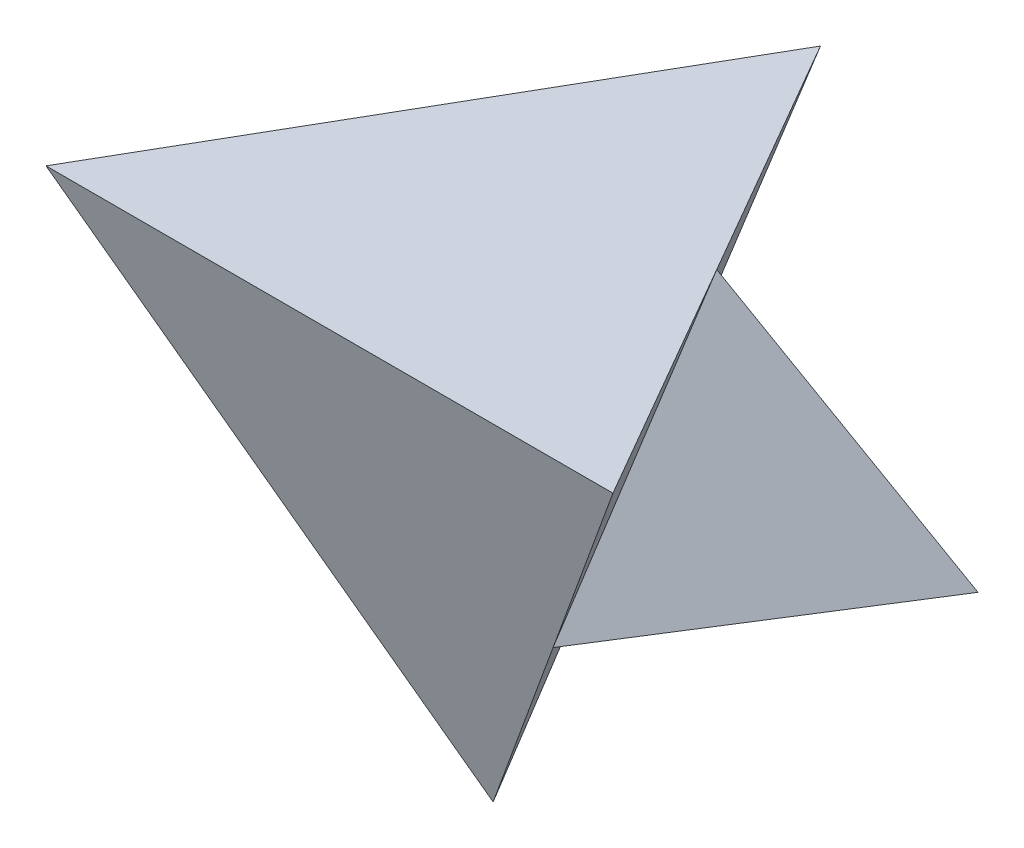
ISO-10303-21;
HEADER;
FILE_DESCRIPTION(('STEP AP214'),'2;1');
FILE_NAME('part.step','',(''),(''),'','','');
FILE_SCHEMA(('AUTOMOTIVE_DESIGN { 1 0 10303 214 1 1 1 1 }'));
ENDSEC;
DATA;
#1=APPLICATION_CONTEXT('core data for automotive mechanical design processes');
#2=APPLICATION_PROTOCOL_DEFINITION('international standard','automotive_design',2000,#1);
#3=PRODUCT_CONTEXT('',#1,'mechanical');
#4=PRODUCT('Part','Part','',(#3));
#5=PRODUCT_RELATED_PRODUCT_CATEGORY('part','',(#4));
#6=PRODUCT_DEFINITION_FORMATION('','',#4);
#7=PRODUCT_DEFINITION_CONTEXT('part definition',#1,'design');
#8=PRODUCT_DEFINITION('design','',#6,#7);
#9=PRODUCT_DEFINITION_SHAPE('','',#8);
#10=(LENGTH_UNIT() NAMED_UNIT(*) SI_UNIT(.MILLI.,.METRE.));
#11=(NAMED_UNIT(*) PLANE_ANGLE_UNIT() SI_UNIT($,.RADIAN.));
#12=(NAMED_UNIT(*) SI_UNIT($,.STERADIAN.) SOLID_ANGLE_UNIT());
#13=UNCERTAINTY_MEASURE_WITH_UNIT(LENGTH_MEASURE(1.E-05),#10,'distance_accuracy_value','');
#14=(GEOMETRIC_REPRESENTATION_CONTEXT(3) GLOBAL_UNCERTAINTY_ASSIGNED_CONTEXT((#13)) GLOBAL_UNIT_ASSIGNED_CONTEXT((#10,
#11,#12)) REPRESENTATION_CONTEXT('',''));
#15=CARTESIAN_POINT('',(0.,0.,0.));
#16=DIRECTION('',(0.,0.,1.));
#17=DIRECTION('',(1.,0.,0.));
#18=AXIS2_PLACEMENT_3D('',#15,#16,#17);
#19=CARTESIAN_POINT('',(0.,0.,-28.8675134594813));
#20=DIRECTION('',(0.821583836257749,-0.316227766016838,-0.474341649025257));
#21=DIRECTION('',(0.5,0.,0.866025403784439));
#22=AXIS2_PLACEMENT_3D('',#19,#20,#21);
#23=PLANE('',#22);
#24=DIRECTION('',(0.480384461415262,0.832050294337843,0.277350098112615));
#25=VECTOR('',#24,1.);
#26=CARTESIAN_POINT('',(6.25000000000001,-10.8253175473055,-10.8253175473055));
#27=LINE('',#26,#25);
#28=CARTESIAN_POINT('',(0.,-21.650635094611,-14.4337567297406));
#29=VERTEX_POINT('',#28);
#30=CARTESIAN_POINT('',(12.5,0.,-7.21687836487031));
#31=VERTEX_POINT('',#30);
#32=EDGE_CURVE('E135',#29,#31,#27,.T.);
#33=ORIENTED_EDGE('',*,*,#32,.F.);
#34=DIRECTION('',(0.,-0.832050294337844,0.554700196225229));
#35=VECTOR('',#34,1.);
#36=CARTESIAN_POINT('',(0.,-21.650635094611,-14.4337567297406));
#37=LINE('',#36,#35);
#38=CARTESIAN_POINT('',(0.,0.,-28.8675134594813));
#39=VERTEX_POINT('',#38);
#40=EDGE_CURVE('E123',#39,#29,#37,.T.);
#41=ORIENTED_EDGE('',*,*,#40,.F.);
#42=DIRECTION('',(0.5,0.,0.866025403784439));
#43=VECTOR('',#42,1.);
#44=CARTESIAN_POINT('',(12.5,0.,-7.21687836487031));
#45=LINE('',#44,#43);
#46=EDGE_CURVE('E12',#39,#31,#45,.T.);
#47=ORIENTED_EDGE('',*,*,#46,.T.);
#48=EDGE_LOOP('',(#33,#41,#47));
#49=FACE_BOUND('',#48,.T.);
#50=ADVANCED_FACE('F119',(#49),#23,.T.);
#51=DIRECTION('',(-0.5,0.,-0.866025403784438));
#52=VECTOR('',#51,1.);
#53=CARTESIAN_POINT('',(6.25,-21.650635094611,-3.60843918243516));
#54=LINE('',#53,#52);
#55=CARTESIAN_POINT('',(12.5,-21.650635094611,7.21687836487033));
#56=VERTEX_POINT('',#55);
#57=EDGE_CURVE('E178',#56,#29,#54,.T.);
#58=ORIENTED_EDGE('',*,*,#57,.F.);
#59=DIRECTION('',(-0.480384461415261,-0.832050294337844,-0.277350098112615));
#60=VECTOR('',#59,1.);
#61=CARTESIAN_POINT('',(12.5,-21.650635094611,7.21687836487032));
#62=LINE('',#61,#60);
#63=CARTESIAN_POINT('',(0.,-43.3012701892219,0.));
#64=VERTEX_POINT('',#63);
#65=EDGE_CURVE('E167',#56,#64,#62,.T.);
#66=ORIENTED_EDGE('',*,*,#65,.T.);
#67=EDGE_CURVE('E180',#29,#64,#37,.T.);
#68=ORIENTED_EDGE('',*,*,#67,.F.);
#69=EDGE_LOOP('',(#58,#66,#68));
#70=FACE_BOUND('',#69,.T.);
#71=ADVANCED_FACE('F179',(#70),#23,.T.);
#72=DIRECTION('',(0.,-0.832050294337844,0.554700196225229));
#73=VECTOR('',#72,1.);
#74=CARTESIAN_POINT('',(12.5,-10.8253175473055,0.));
#75=LINE('',#74,#73);
#76=EDGE_CURVE('E143',#31,#56,#75,.T.);
#77=ORIENTED_EDGE('',*,*,#76,.F.);
#78=CARTESIAN_POINT('',(25.,0.,14.4337567297406));
#79=VERTEX_POINT('',#78);
#80=EDGE_CURVE('E128',#31,#79,#45,.T.);
#81=ORIENTED_EDGE('',*,*,#80,.T.);
#82=EDGE_CURVE('E161',#79,#56,#62,.T.);
#83=ORIENTED_EDGE('',*,*,#82,.T.);
#84=EDGE_LOOP('',(#77,#81,#83));
#85=FACE_BOUND('',#84,.T.);
#86=ADVANCED_FACE('F163',(#85),#23,.T.);
#87=CARTESIAN_POINT('',(25.,0.,14.4337567297406));
#88=DIRECTION('',(0.,-0.316227766016838,0.948683298050514));
#89=DIRECTION('',(-1.,0.,0.));
#90=AXIS2_PLACEMENT_3D('',#87,#88,#89);
#91=PLANE('',#90);
#92=DIRECTION('',(-1.,0.,0.));
#93=VECTOR('',#92,1.);
#94=CARTESIAN_POINT('',(0.,0.,14.4337567297406));
#95=LINE('',#94,#93);
#96=CARTESIAN_POINT('',(-25.,0.,14.4337567297406));
#97=VERTEX_POINT('',#96);
#98=EDGE_CURVE('E176',#79,#97,#95,.T.);
#99=ORIENTED_EDGE('',*,*,#98,.T.);
#100=DIRECTION('',(0.480384461415261,-0.832050294337844,-0.277350098112615));
#101=VECTOR('',#100,1.);
#102=CARTESIAN_POINT('',(-12.5,-21.650635094611,7.21687836487032));
#103=LINE('',#102,#101);
#104=EDGE_CURVE('E174',#97,#64,#103,.T.);
#105=ORIENTED_EDGE('',*,*,#104,.T.);
#106=ORIENTED_EDGE('',*,*,#65,.F.);
#107=ORIENTED_EDGE('',*,*,#82,.F.);
#108=EDGE_LOOP('',(#99,#105,#106,#107));
#109=FACE_BOUND('',#108,.T.);
#110=ADVANCED_FACE('F172',(#109),#91,.T.);
#111=CARTESIAN_POINT('',(-25.,0.,14.4337567297406));
#112=DIRECTION('',(-0.821583836257749,-0.316227766016838,-0.474341649025257));
#113=DIRECTION('',(0.5,0.,-0.866025403784438));
#114=AXIS2_PLACEMENT_3D('',#111,#112,#113);
#115=PLANE('',#114);
#116=DIRECTION('',(0.5,0.,-0.866025403784439));
#117=VECTOR('',#116,1.);
#118=CARTESIAN_POINT('',(-12.5,0.,-7.21687836487032));
#119=LINE('',#118,#117);
#120=EDGE_CURVE('E202',#97,#39,#119,.T.);
#121=ORIENTED_EDGE('',*,*,#120,.T.);
#122=ORIENTED_EDGE('',*,*,#40,.T.);
#123=ORIENTED_EDGE('',*,*,#67,.T.);
#124=ORIENTED_EDGE('',*,*,#104,.F.);
#125=EDGE_LOOP('',(#121,#122,#123,#124));
#126=FACE_BOUND('',#125,.T.);
#127=ADVANCED_FACE('F121',(#126),#115,.T.);
#128=CARTESIAN_POINT('',(0.,0.,0.));
#129=DIRECTION('',(0.,-1.,0.));
#130=DIRECTION('',(0.,0.,-1.));
#131=AXIS2_PLACEMENT_3D('',#128,#129,#130);
#132=PLANE('',#131);
#133=ORIENTED_EDGE('',*,*,#120,.F.);
#134=ORIENTED_EDGE('',*,*,#98,.F.);
#135=ORIENTED_EDGE('',*,*,#80,.F.);
#136=ORIENTED_EDGE('',*,*,#46,.F.);
#137=EDGE_LOOP('',(#133,#134,#135,#136));
#138=FACE_BOUND('',#137,.T.);
#139=ADVANCED_FACE('F206',(#138),#132,.F.);
#140=CARTESIAN_POINT('',(12.5,0.,-7.21687836487031));
#141=DIRECTION('',(0.792398877108269,0.3383689472739,0.50755342091085));
#142=DIRECTION('',(0.,-0.832050294337844,0.554700196225229));
#143=AXIS2_PLACEMENT_3D('',#140,#141,#142);
#144=PLANE('',#143);
#145=ORIENTED_EDGE('',*,*,#76,.T.);
#146=DIRECTION('',(0.538358958313562,0.00332429614441685,-0.842709072609688));
#147=VECTOR('',#146,1.);
#148=CARTESIAN_POINT('',(19.8046875,-21.6055296048305,-4.21736329447109));
#149=LINE('',#148,#147);
#150=CARTESIAN_POINT('',(27.109375,-21.5604241150501,-15.6516049538125));
#151=VERTEX_POINT('',#150);
#152=EDGE_CURVE('E186',#56,#151,#149,.T.);
#153=ORIENTED_EDGE('',*,*,#152,.T.);
#154=DIRECTION('',(0.533661658721884,-0.787574533201108,-0.308109702319262));
#155=VECTOR('',#154,1.);
#156=CARTESIAN_POINT('',(19.8046875,-10.780212057525,-11.4342416593414));
#157=LINE('',#156,#155);
#158=EDGE_CURVE('E193',#31,#151,#157,.T.);
#159=ORIENTED_EDGE('',*,*,#158,.F.);
#160=EDGE_LOOP('',(#145,#153,#159));
#161=FACE_BOUND('',#160,.T.);
#162=ADVANCED_FACE('F192',(#161),#144,.T.);
#163=CARTESIAN_POINT('',(12.5,-21.650635094611,7.21687836487033));
#164=DIRECTION('',(0.00324351808914522,-0.999992986369008,-0.00187264604188957));
#165=DIRECTION('',(-0.5,0.,-0.866025403784438));
#166=AXIS2_PLACEMENT_3D('',#163,#164,#165);
#167=PLANE('',#166);
#168=ORIENTED_EDGE('',*,*,#57,.T.);
#169=DIRECTION('',(0.998986944036396,0.00332429614441672,-0.0448779979496283));
#170=VECTOR('',#169,1.);
#171=CARTESIAN_POINT('',(13.5546875,-21.6055296048305,-15.0426808417766));
#172=LINE('',#171,#170);
#173=EDGE_CURVE('E187',#29,#151,#172,.T.);
#174=ORIENTED_EDGE('',*,*,#173,.T.);
#175=ORIENTED_EDGE('',*,*,#152,.F.);
#176=EDGE_LOOP('',(#168,#174,#175));
#177=FACE_BOUND('',#176,.T.);
#178=ADVANCED_FACE('F195',(#177),#167,.T.);
#179=CARTESIAN_POINT('',(0.,-21.650635094611,-14.4337567297406));
#180=DIRECTION('',(-0.0433547177323574,0.3383689472739,-0.94001426796145));
#181=DIRECTION('',(0.480384461415262,0.832050294337843,0.277350098112615));
#182=AXIS2_PLACEMENT_3D('',#179,#180,#181);
#183=PLANE('',#182);
#184=ORIENTED_EDGE('',*,*,#32,.T.);
#185=ORIENTED_EDGE('',*,*,#158,.T.);
#186=ORIENTED_EDGE('',*,*,#173,.F.);
#187=EDGE_LOOP('',(#184,#185,#186));
#188=FACE_BOUND('',#187,.T.);
#189=ADVANCED_FACE('F256',(#188),#183,.T.);
#190=CLOSED_SHELL('',(#50,#71,#86,#110,#127,#139,#162,#178,#189));
#191=MANIFOLD_SOLID_BREP('B2',#190);
#192=ADVANCED_BREP_SHAPE_REPRESENTATION('',(#18,#191),#14);
#193=SHAPE_DEFINITION_REPRESENTATION(#9,#192);
ENDSEC;
END-ISO-10303-21;
